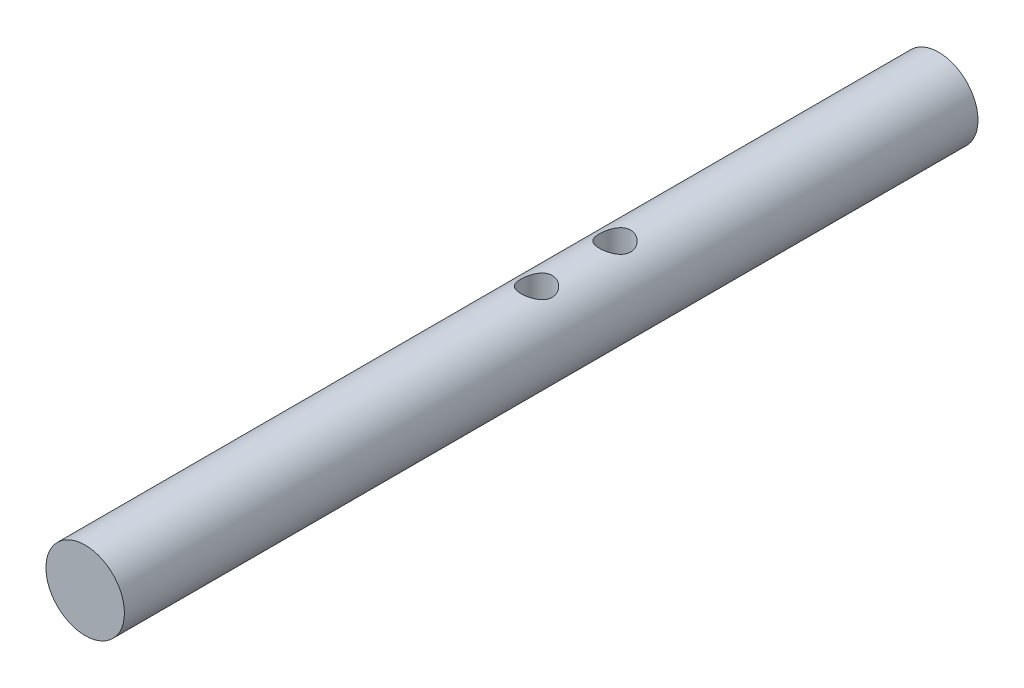
ISO-10303-21;
HEADER;
FILE_DESCRIPTION(('STEP AP214'),'2;1');
FILE_NAME('part.step','',(''),(''),'','','');
FILE_SCHEMA(('AUTOMOTIVE_DESIGN { 1 0 10303 214 1 1 1 1 }'));
ENDSEC;
DATA;
#1=APPLICATION_CONTEXT('core data for automotive mechanical design processes');
#2=APPLICATION_PROTOCOL_DEFINITION('international standard','automotive_design',2000,#1);
#3=PRODUCT_CONTEXT('',#1,'mechanical');
#4=PRODUCT('Part','Part','',(#3));
#5=PRODUCT_RELATED_PRODUCT_CATEGORY('part','',(#4));
#6=PRODUCT_DEFINITION_FORMATION('','',#4);
#7=PRODUCT_DEFINITION_CONTEXT('part definition',#1,'design');
#8=PRODUCT_DEFINITION('design','',#6,#7);
#9=PRODUCT_DEFINITION_SHAPE('','',#8);
#10=(LENGTH_UNIT() NAMED_UNIT(*) SI_UNIT(.MILLI.,.METRE.));
#11=(NAMED_UNIT(*) PLANE_ANGLE_UNIT() SI_UNIT($,.RADIAN.));
#12=(NAMED_UNIT(*) SI_UNIT($,.STERADIAN.) SOLID_ANGLE_UNIT());
#13=UNCERTAINTY_MEASURE_WITH_UNIT(LENGTH_MEASURE(1.E-05),#10,'distance_accuracy_value','');
#14=(GEOMETRIC_REPRESENTATION_CONTEXT(3) GLOBAL_UNCERTAINTY_ASSIGNED_CONTEXT((#13)) GLOBAL_UNIT_ASSIGNED_CONTEXT((#10,
#11,#12)) REPRESENTATION_CONTEXT('',''));
#15=CARTESIAN_POINT('',(0.,0.,0.));
#16=DIRECTION('',(0.,0.,1.));
#17=DIRECTION('',(1.,0.,0.));
#18=AXIS2_PLACEMENT_3D('',#15,#16,#17);
#19=CARTESIAN_POINT('',(0.,0.,87.));
#20=DIRECTION('',(0.,0.,-1.));
#21=DIRECTION('',(-1.,0.,0.));
#22=AXIS2_PLACEMENT_3D('',#19,#20,#21);
#23=CYLINDRICAL_SURFACE('',#22,4.);
#24=CARTESIAN_POINT('',(0.,-4.,34.6));
#25=CARTESIAN_POINT('',(0.0859944043543132,-3.99999416981668,34.599992118541));
#26=CARTESIAN_POINT('',(0.172138051272539,-3.99719435445546,34.5930257983293));
#27=CARTESIAN_POINT('',(0.341997184334317,-3.98626762480513,34.565401837183));
#28=CARTESIAN_POINT('',(0.425705422048998,-3.97812622959102,34.5447069767311));
#29=CARTESIAN_POINT('',(0.587963138181921,-3.95739367370495,34.4904991375529));
#30=CARTESIAN_POINT('',(0.666528529293566,-3.94481709091258,34.4570281230266));
#31=CARTESIAN_POINT('',(0.816857576262693,-3.91645288636862,34.3783846613388));
#32=CARTESIAN_POINT('',(0.888623581400793,-3.90066637966445,34.3332162760649));
#33=CARTESIAN_POINT('',(1.02680080605631,-3.86664708936335,34.2302116011513));
#34=CARTESIAN_POINT('',(1.09284981804017,-3.84833837543352,34.1719146750078));
#35=CARTESIAN_POINT('',(1.21454000382778,-3.81168461524956,34.0452799972186));
#36=CARTESIAN_POINT('',(1.27017608570683,-3.79333955563034,33.9769373622306));
#37=CARTESIAN_POINT('',(1.3718996538343,-3.75778233437709,33.8284575438062));
#38=CARTESIAN_POINT('',(1.41745198495638,-3.74065692771961,33.7479308111814));
#39=CARTESIAN_POINT('',(1.49420377522972,-3.71066917749434,33.579570881264));
#40=CARTESIAN_POINT('',(1.52541005142867,-3.69780480995341,33.4917411777213));
#41=CARTESIAN_POINT('',(1.57111905871669,-3.67861086128655,33.3154301331263));
#42=CARTESIAN_POINT('',(1.58631517264452,-3.67201136284484,33.227159011539));
#43=CARTESIAN_POINT('',(1.60173836931202,-3.66531203239315,33.0490920013542));
#44=CARTESIAN_POINT('',(1.60197281305058,-3.66520900418215,32.9592968843));
#45=CARTESIAN_POINT('',(1.58799149400363,-3.67128400223995,32.7873946628336));
#46=CARTESIAN_POINT('',(1.57478025144411,-3.6770254003076,32.7051874284728));
#47=CARTESIAN_POINT('',(1.53595750423826,-3.69340950086269,32.5442723551946));
#48=CARTESIAN_POINT('',(1.51034383584371,-3.70405305857338,32.4655651295118));
#49=CARTESIAN_POINT('',(1.44695578604086,-3.72927588070824,32.3119857310432));
#50=CARTESIAN_POINT('',(1.40894388985225,-3.7439310342463,32.2372246087563));
#51=CARTESIAN_POINT('',(1.32200516858577,-3.77550493111912,32.0948673469107));
#52=CARTESIAN_POINT('',(1.27307424408067,-3.79242452365479,32.0272739124778));
#53=CARTESIAN_POINT('',(1.16124047956355,-3.82821389393817,31.8956722169584));
#54=CARTESIAN_POINT('',(1.09754997037651,-3.84713331980921,31.8323450164432));
#55=CARTESIAN_POINT('',(0.960251541944155,-3.88367859966626,31.7170524175984));
#56=CARTESIAN_POINT('',(0.886641652267547,-3.9013041955626,31.6650892820718));
#57=CARTESIAN_POINT('',(0.729662122084675,-3.93371745011639,31.5731060420673));
#58=CARTESIAN_POINT('',(0.646128393077183,-3.94844216076332,31.5333421750424));
#59=CARTESIAN_POINT('',(0.472819012386307,-3.97291862663007,31.4686657111376));
#60=CARTESIAN_POINT('',(0.383046557479741,-3.98267290769906,31.4437455699541));
#61=CARTESIAN_POINT('',(0.205516710086258,-3.99564911605528,31.4108413636642));
#62=CARTESIAN_POINT('',(0.117954635188429,-3.99922356666811,31.4019420365972));
#63=CARTESIAN_POINT('',(-0.0574762478462529,-4.00054782808505,31.3986295195771));
#64=CARTESIAN_POINT('',(-0.145344970579138,-3.99829914865833,31.404212574762));
#65=CARTESIAN_POINT('',(-0.31474619129759,-3.98846053651002,31.4290334020416));
#66=CARTESIAN_POINT('',(-0.39638599342038,-3.98111513076419,31.4476463842808));
#67=CARTESIAN_POINT('',(-0.555308342448624,-3.962075531244,31.4971485666478));
#68=CARTESIAN_POINT('',(-0.632590328179876,-3.95038077885224,31.5280393437349));
#69=CARTESIAN_POINT('',(-0.783263028653363,-3.92333275816649,31.602227951744));
#70=CARTESIAN_POINT('',(-0.856462418204326,-3.90787852783843,31.6458763776345));
#71=CARTESIAN_POINT('',(-0.994754872997245,-3.8749869179642,31.7439522591245));
#72=CARTESIAN_POINT('',(-1.0598446726089,-3.85754874488216,31.7983840343381));
#73=CARTESIAN_POINT('',(-1.18457843442305,-3.82116094110489,31.9206960103597));
#74=CARTESIAN_POINT('',(-1.24357914704485,-3.80218753140042,31.989226833205));
#75=CARTESIAN_POINT('',(-1.34940095793097,-3.76593338333706,32.1355520664075));
#76=CARTESIAN_POINT('',(-1.39622004907001,-3.74865292421209,32.213348000272));
#77=CARTESIAN_POINT('',(-1.4766460015453,-3.71771439926167,32.3771693556753));
#78=CARTESIAN_POINT('',(-1.51012047562756,-3.7040930470783,32.4632671993699));
#79=CARTESIAN_POINT('',(-1.56183697576424,-3.68258938782345,32.6405869213721));
#80=CARTESIAN_POINT('',(-1.58009024421545,-3.67470284556799,32.7318049646499));
#81=CARTESIAN_POINT('',(-1.59977249382272,-3.66617407439941,32.9097023214196));
#82=CARTESIAN_POINT('',(-1.60231766584229,-3.66505136806537,32.9962358716747));
#83=CARTESIAN_POINT('',(-1.59344252742202,-3.66891868826478,33.1684358861706));
#84=CARTESIAN_POINT('',(-1.58202399033102,-3.67390793859835,33.2541024591221));
#85=CARTESIAN_POINT('',(-1.54645709292292,-3.68901319263217,33.418665751884));
#86=CARTESIAN_POINT('',(-1.52282999485678,-3.6989186546196,33.4976962195464));
#87=CARTESIAN_POINT('',(-1.46400435879281,-3.72259200986157,33.6507029036908));
#88=CARTESIAN_POINT('',(-1.42880262511505,-3.73636096964805,33.7246777175199));
#89=CARTESIAN_POINT('',(-1.34549821020778,-3.76718887683593,33.8700876954166));
#90=CARTESIAN_POINT('',(-1.29677226812759,-3.78439105850594,33.9411349361044));
#91=CARTESIAN_POINT('',(-1.18871369541719,-3.8197104349779,34.074394653763));
#92=CARTESIAN_POINT('',(-1.12937786785449,-3.83782790438725,34.1366044577027));
#93=CARTESIAN_POINT('',(-0.997204405017967,-3.87434853669915,34.2545622826109));
#94=CARTESIAN_POINT('',(-0.923740800916907,-3.89269406369748,34.3096298455185));
#95=CARTESIAN_POINT('',(-0.76792025622862,-3.92640325370973,34.4066696340973));
#96=CARTESIAN_POINT('',(-0.685559203637787,-3.94176552874325,34.448635769722));
#97=CARTESIAN_POINT('',(-0.515790449996161,-3.96751771852689,34.5172977721522));
#98=CARTESIAN_POINT('',(-0.428505294575756,-3.97799490444022,34.5442634588483));
#99=CARTESIAN_POINT('',(-0.250301237024976,-3.99315444967493,34.5829112967634));
#100=CARTESIAN_POINT('',(-0.15939482068713,-3.9978551959651,34.5946419493951));
#101=CARTESIAN_POINT('',(-0.0455298383127436,-3.99980719603309,34.5995163047826));
#102=CARTESIAN_POINT('',(-0.0227701509926067,-4.00000154375341,34.6000020869034));
#103=CARTESIAN_POINT('',(0.,-4.,34.6));
#104=B_SPLINE_CURVE_WITH_KNOTS('',3,(#24,#25,#26,#27,#28,#29,#30,#31,#32,#33,#34,#35,#36,#37,
#38,#39,#40,#41,#42,#43,#44,#45,#46,#47,#48,#49,#50,#51,#52,#53,#54,#55,#56,#57,#58,#59,#60,#61,
#62,#63,#64,#65,#66,#67,#68,#69,#70,#71,#72,#73,#74,#75,#76,#77,#78,#79,#80,#81,#82,#83,#84,#85,
#86,#87,#88,#89,#90,#91,#92,#93,#94,#95,#96,#97,#98,#99,#100,#101,#102,#103),.UNSPECIFIED.,.T.,
.F.,(4,2,2,2,2,2,2,2,2,2,2,2,2,2,2,2,2,2,2,2,2,2,2,2,2,2,2,2,2,2,2,2,2,2,2,2,2,2,2,4),(0.,
0.257922390314457,0.516546908806347,0.774329165977264,1.03202202854387,1.30077905360318,
1.56966715947529,1.85052207055373,2.13124338494615,2.39923284247063,2.6670904507239,
2.91630662721097,3.16556629804837,3.41991301039053,3.67435537550546,3.94846679349245,
4.22263274271786,4.50221530530245,4.78165564891032,5.04455347622405,5.30738314856065,
5.55840364451492,5.80945639195037,6.0681881071861,6.32702367599175,6.6029477969953,
6.87891735234998,7.15756036112661,7.43599738116746,7.69439738714198,7.95276458050435,
8.20091454839014,8.44913308644129,8.71156374445353,8.97407361078714,9.25360338827068,
9.53326290912426,9.80771440810654,10.0812900192347,10.1495843671744),.UNSPECIFIED.);
#105=CARTESIAN_POINT('',(0.,-4.,34.6));
#106=VERTEX_POINT('',#105);
#107=EDGE_CURVE('E10',#106,#106,#104,.T.);
#108=ORIENTED_EDGE('',*,*,#107,.T.);
#109=EDGE_LOOP('',(#108));
#110=FACE_BOUND('',#109,.T.);
#111=CARTESIAN_POINT('',(0.,4.,34.6));
#112=CARTESIAN_POINT('',(-0.0859944043543132,3.99999416981668,34.599992118541));
#113=CARTESIAN_POINT('',(-0.172138051272539,3.99719435445546,34.5930257983293));
#114=CARTESIAN_POINT('',(-0.341997184334317,3.98626762480513,34.565401837183));
#115=CARTESIAN_POINT('',(-0.425705422048998,3.97812622959102,34.5447069767311));
#116=CARTESIAN_POINT('',(-0.587963138181921,3.95739367370495,34.4904991375529));
#117=CARTESIAN_POINT('',(-0.666528529293566,3.94481709091258,34.4570281230266));
#118=CARTESIAN_POINT('',(-0.816857576262693,3.91645288636862,34.3783846613388));
#119=CARTESIAN_POINT('',(-0.888623581400793,3.90066637966445,34.3332162760649));
#120=CARTESIAN_POINT('',(-1.02680080605631,3.86664708936335,34.2302116011513));
#121=CARTESIAN_POINT('',(-1.09284981804017,3.84833837543352,34.1719146750078));
#122=CARTESIAN_POINT('',(-1.21454000382778,3.81168461524956,34.0452799972186));
#123=CARTESIAN_POINT('',(-1.27017608570683,3.79333955563034,33.9769373622306));
#124=CARTESIAN_POINT('',(-1.3718996538343,3.75778233437709,33.8284575438062));
#125=CARTESIAN_POINT('',(-1.41745198495638,3.74065692771961,33.7479308111814));
#126=CARTESIAN_POINT('',(-1.49420377522972,3.71066917749434,33.579570881264));
#127=CARTESIAN_POINT('',(-1.52541005142867,3.69780480995341,33.4917411777213));
#128=CARTESIAN_POINT('',(-1.57111905871669,3.67861086128655,33.3154301331263));
#129=CARTESIAN_POINT('',(-1.58631517264452,3.67201136284484,33.227159011539));
#130=CARTESIAN_POINT('',(-1.60173836931202,3.66531203239315,33.0490920013542));
#131=CARTESIAN_POINT('',(-1.60197281305058,3.66520900418215,32.9592968843));
#132=CARTESIAN_POINT('',(-1.58799149400363,3.67128400223995,32.7873946628336));
#133=CARTESIAN_POINT('',(-1.57478025144411,3.6770254003076,32.7051874284728));
#134=CARTESIAN_POINT('',(-1.53595750423826,3.69340950086269,32.5442723551946));
#135=CARTESIAN_POINT('',(-1.51034383584371,3.70405305857338,32.4655651295118));
#136=CARTESIAN_POINT('',(-1.44695578604086,3.72927588070824,32.3119857310432));
#137=CARTESIAN_POINT('',(-1.40894388985225,3.7439310342463,32.2372246087563));
#138=CARTESIAN_POINT('',(-1.32200516858577,3.77550493111912,32.0948673469107));
#139=CARTESIAN_POINT('',(-1.27307424408067,3.79242452365479,32.0272739124778));
#140=CARTESIAN_POINT('',(-1.16124047956355,3.82821389393817,31.8956722169584));
#141=CARTESIAN_POINT('',(-1.09754997037651,3.84713331980921,31.8323450164432));
#142=CARTESIAN_POINT('',(-0.960251541944155,3.88367859966626,31.7170524175984));
#143=CARTESIAN_POINT('',(-0.886641652267547,3.9013041955626,31.6650892820718));
#144=CARTESIAN_POINT('',(-0.729662122084675,3.93371745011639,31.5731060420673));
#145=CARTESIAN_POINT('',(-0.646128393077183,3.94844216076332,31.5333421750424));
#146=CARTESIAN_POINT('',(-0.472819012386307,3.97291862663007,31.4686657111376));
#147=CARTESIAN_POINT('',(-0.383046557479741,3.98267290769906,31.4437455699541));
#148=CARTESIAN_POINT('',(-0.205516710086258,3.99564911605528,31.4108413636642));
#149=CARTESIAN_POINT('',(-0.117954635188429,3.99922356666811,31.4019420365972));
#150=CARTESIAN_POINT('',(0.0574762478462529,4.00054782808505,31.3986295195771));
#151=CARTESIAN_POINT('',(0.145344970579138,3.99829914865833,31.404212574762));
#152=CARTESIAN_POINT('',(0.31474619129759,3.98846053651002,31.4290334020416));
#153=CARTESIAN_POINT('',(0.39638599342038,3.98111513076419,31.4476463842808));
#154=CARTESIAN_POINT('',(0.555308342448624,3.962075531244,31.4971485666478));
#155=CARTESIAN_POINT('',(0.632590328179876,3.95038077885224,31.5280393437349));
#156=CARTESIAN_POINT('',(0.783263028653363,3.92333275816649,31.602227951744));
#157=CARTESIAN_POINT('',(0.856462418204326,3.90787852783843,31.6458763776345));
#158=CARTESIAN_POINT('',(0.994754872997245,3.8749869179642,31.7439522591245));
#159=CARTESIAN_POINT('',(1.0598446726089,3.85754874488216,31.7983840343381));
#160=CARTESIAN_POINT('',(1.18457843442305,3.82116094110489,31.9206960103597));
#161=CARTESIAN_POINT('',(1.24357914704485,3.80218753140042,31.989226833205));
#162=CARTESIAN_POINT('',(1.34940095793097,3.76593338333706,32.1355520664075));
#163=CARTESIAN_POINT('',(1.39622004907001,3.74865292421209,32.213348000272));
#164=CARTESIAN_POINT('',(1.4766460015453,3.71771439926167,32.3771693556753));
#165=CARTESIAN_POINT('',(1.51012047562756,3.7040930470783,32.4632671993699));
#166=CARTESIAN_POINT('',(1.56183697576424,3.68258938782345,32.6405869213721));
#167=CARTESIAN_POINT('',(1.58009024421545,3.67470284556799,32.7318049646499));
#168=CARTESIAN_POINT('',(1.59977249382272,3.66617407439941,32.9097023214196));
#169=CARTESIAN_POINT('',(1.60231766584229,3.66505136806537,32.9962358716747));
#170=CARTESIAN_POINT('',(1.59344252742202,3.66891868826478,33.1684358861706));
#171=CARTESIAN_POINT('',(1.58202399033102,3.67390793859835,33.2541024591221));
#172=CARTESIAN_POINT('',(1.54645709292292,3.68901319263217,33.418665751884));
#173=CARTESIAN_POINT('',(1.52282999485678,3.6989186546196,33.4976962195464));
#174=CARTESIAN_POINT('',(1.46400435879281,3.72259200986157,33.6507029036908));
#175=CARTESIAN_POINT('',(1.42880262511505,3.73636096964805,33.7246777175199));
#176=CARTESIAN_POINT('',(1.34549821020778,3.76718887683593,33.8700876954166));
#177=CARTESIAN_POINT('',(1.29677226812759,3.78439105850594,33.9411349361044));
#178=CARTESIAN_POINT('',(1.18871369541719,3.8197104349779,34.074394653763));
#179=CARTESIAN_POINT('',(1.12937786785449,3.83782790438725,34.1366044577027));
#180=CARTESIAN_POINT('',(0.997204405017967,3.87434853669915,34.2545622826109));
#181=CARTESIAN_POINT('',(0.923740800916907,3.89269406369748,34.3096298455185));
#182=CARTESIAN_POINT('',(0.76792025622862,3.92640325370973,34.4066696340973));
#183=CARTESIAN_POINT('',(0.685559203637787,3.94176552874325,34.448635769722));
#184=CARTESIAN_POINT('',(0.515790449996161,3.96751771852689,34.5172977721522));
#185=CARTESIAN_POINT('',(0.428505294575756,3.97799490444022,34.5442634588483));
#186=CARTESIAN_POINT('',(0.250301237024976,3.99315444967493,34.5829112967634));
#187=CARTESIAN_POINT('',(0.15939482068713,3.9978551959651,34.5946419493951));
#188=CARTESIAN_POINT('',(0.0455298383127436,3.99980719603309,34.5995163047826));
#189=CARTESIAN_POINT('',(0.0227701509926067,4.00000154375341,34.6000020869034));
#190=CARTESIAN_POINT('',(0.,4.,34.6));
#191=B_SPLINE_CURVE_WITH_KNOTS('',3,(#111,#112,#113,#114,#115,#116,#117,#118,#119,#120,#121,
#122,#123,#124,#125,#126,#127,#128,#129,#130,#131,#132,#133,#134,#135,#136,#137,#138,#139,#140,
#141,#142,#143,#144,#145,#146,#147,#148,#149,#150,#151,#152,#153,#154,#155,#156,#157,#158,#159,
#160,#161,#162,#163,#164,#165,#166,#167,#168,#169,#170,#171,#172,#173,#174,#175,#176,#177,#178,
#179,#180,#181,#182,#183,#184,#185,#186,#187,#188,#189,#190),.UNSPECIFIED.,.T.,.F.,(4,2,2,2,2,2,
2,2,2,2,2,2,2,2,2,2,2,2,2,2,2,2,2,2,2,2,2,2,2,2,2,2,2,2,2,2,2,2,2,4),(0.,0.257922390314457,
0.516546908806347,0.774329165977264,1.03202202854387,1.30077905360318,1.56966715947529,
1.85052207055373,2.13124338494615,2.39923284247063,2.6670904507239,2.91630662721097,
3.16556629804837,3.41991301039053,3.67435537550546,3.94846679349245,4.22263274271786,
4.50221530530245,4.78165564891032,5.04455347622405,5.30738314856065,5.55840364451492,
5.80945639195037,6.0681881071861,6.32702367599175,6.6029477969953,6.87891735234998,
7.15756036112661,7.43599738116746,7.69439738714198,7.95276458050435,8.20091454839014,
8.44913308644129,8.71156374445353,8.97407361078714,9.25360338827068,9.53326290912426,
9.80771440810654,10.0812900192347,10.1495843671744),.UNSPECIFIED.);
#192=CARTESIAN_POINT('',(0.,4.,34.6));
#193=VERTEX_POINT('',#192);
#194=EDGE_CURVE('E43',#193,#193,#191,.T.);
#195=ORIENTED_EDGE('',*,*,#194,.T.);
#196=EDGE_LOOP('',(#195));
#197=FACE_BOUND('',#196,.T.);
#198=CARTESIAN_POINT('',(0.,-4.,42.6));
#199=CARTESIAN_POINT('',(0.0859944043543127,-3.99999416981668,42.599992118541));
#200=CARTESIAN_POINT('',(0.172138051272539,-3.99719435445546,42.5930257983293));
#201=CARTESIAN_POINT('',(0.341997184334316,-3.98626762480513,42.565401837183));
#202=CARTESIAN_POINT('',(0.425705422048997,-3.97812622959102,42.5447069767311));
#203=CARTESIAN_POINT('',(0.587963138181921,-3.95739367370495,42.4904991375529));
#204=CARTESIAN_POINT('',(0.666528529293566,-3.94481709091258,42.4570281230266));
#205=CARTESIAN_POINT('',(0.816857576262693,-3.91645288636862,42.3783846613388));
#206=CARTESIAN_POINT('',(0.888623581400793,-3.90066637966445,42.3332162760649));
#207=CARTESIAN_POINT('',(1.02680080605631,-3.86664708936335,42.2302116011513));
#208=CARTESIAN_POINT('',(1.09284981804017,-3.84833837543353,42.1719146750078));
#209=CARTESIAN_POINT('',(1.21454000382777,-3.81168461524956,42.0452799972186));
#210=CARTESIAN_POINT('',(1.27017608570682,-3.79333955563034,41.9769373622306));
#211=CARTESIAN_POINT('',(1.3718996538343,-3.75778233437709,41.8284575438062));
#212=CARTESIAN_POINT('',(1.41745198495638,-3.74065692771961,41.7479308111814));
#213=CARTESIAN_POINT('',(1.49420377522972,-3.71066917749434,41.579570881264));
#214=CARTESIAN_POINT('',(1.52541005142867,-3.69780480995341,41.4917411777213));
#215=CARTESIAN_POINT('',(1.57111905871669,-3.67861086128655,41.3154301331263));
#216=CARTESIAN_POINT('',(1.58631517264452,-3.67201136284484,41.227159011539));
#217=CARTESIAN_POINT('',(1.60173836931202,-3.66531203239315,41.0490920013542));
#218=CARTESIAN_POINT('',(1.60197281305058,-3.66520900418215,40.9592968843));
#219=CARTESIAN_POINT('',(1.58799149400363,-3.67128400223995,40.7873946628336));
#220=CARTESIAN_POINT('',(1.57478025144411,-3.6770254003076,40.7051874284728));
#221=CARTESIAN_POINT('',(1.53595750423826,-3.69340950086269,40.5442723551946));
#222=CARTESIAN_POINT('',(1.51034383584371,-3.70405305857338,40.4655651295118));
#223=CARTESIAN_POINT('',(1.44695578604086,-3.72927588070824,40.3119857310432));
#224=CARTESIAN_POINT('',(1.40894388985225,-3.7439310342463,40.2372246087563));
#225=CARTESIAN_POINT('',(1.32200516858577,-3.77550493111912,40.0948673469107));
#226=CARTESIAN_POINT('',(1.27307424408067,-3.79242452365479,40.0272739124778));
#227=CARTESIAN_POINT('',(1.16124047956355,-3.82821389393817,39.8956722169584));
#228=CARTESIAN_POINT('',(1.09754997037651,-3.84713331980921,39.8323450164432));
#229=CARTESIAN_POINT('',(0.960251541944158,-3.88367859966626,39.7170524175984));
#230=CARTESIAN_POINT('',(0.886641652267549,-3.9013041955626,39.6650892820718));
#231=CARTESIAN_POINT('',(0.729662122084674,-3.93371745011639,39.5731060420673));
#232=CARTESIAN_POINT('',(0.646128393077183,-3.94844216076332,39.5333421750424));
#233=CARTESIAN_POINT('',(0.472819012386307,-3.97291862663007,39.4686657111376));
#234=CARTESIAN_POINT('',(0.383046557479741,-3.98267290769906,39.4437455699541));
#235=CARTESIAN_POINT('',(0.205516710086258,-3.99564911605528,39.4108413636642));
#236=CARTESIAN_POINT('',(0.117954635188429,-3.99922356666811,39.4019420365971));
#237=CARTESIAN_POINT('',(-0.0574762478462528,-4.00054782808505,39.3986295195771));
#238=CARTESIAN_POINT('',(-0.145344970579138,-3.99829914865833,39.404212574762));
#239=CARTESIAN_POINT('',(-0.31474619129759,-3.98846053651002,39.4290334020416));
#240=CARTESIAN_POINT('',(-0.39638599342038,-3.98111513076419,39.4476463842808));
#241=CARTESIAN_POINT('',(-0.555308342448624,-3.962075531244,39.4971485666479));
#242=CARTESIAN_POINT('',(-0.632590328179875,-3.95038077885224,39.5280393437349));
#243=CARTESIAN_POINT('',(-0.783263028653361,-3.92333275816649,39.602227951744));
#244=CARTESIAN_POINT('',(-0.856462418204325,-3.90787852783843,39.6458763776345));
#245=CARTESIAN_POINT('',(-0.994754872997244,-3.8749869179642,39.7439522591245));
#246=CARTESIAN_POINT('',(-1.0598446726089,-3.85754874488216,39.7983840343381));
#247=CARTESIAN_POINT('',(-1.18457843442305,-3.82116094110489,39.9206960103597));
#248=CARTESIAN_POINT('',(-1.24357914704485,-3.80218753140042,39.989226833205));
#249=CARTESIAN_POINT('',(-1.34940095793097,-3.76593338333706,40.1355520664075));
#250=CARTESIAN_POINT('',(-1.39622004907001,-3.74865292421209,40.213348000272));
#251=CARTESIAN_POINT('',(-1.4766460015453,-3.71771439926167,40.3771693556753));
#252=CARTESIAN_POINT('',(-1.51012047562756,-3.7040930470783,40.4632671993698));
#253=CARTESIAN_POINT('',(-1.56183697576424,-3.68258938782345,40.6405869213721));
#254=CARTESIAN_POINT('',(-1.58009024421545,-3.67470284556799,40.7318049646499));
#255=CARTESIAN_POINT('',(-1.59977249382272,-3.66617407439941,40.9097023214196));
#256=CARTESIAN_POINT('',(-1.60231766584229,-3.66505136806537,40.9962358716747));
#257=CARTESIAN_POINT('',(-1.59344252742202,-3.66891868826478,41.1684358861706));
#258=CARTESIAN_POINT('',(-1.58202399033102,-3.67390793859835,41.2541024591221));
#259=CARTESIAN_POINT('',(-1.54645709292292,-3.68901319263217,41.418665751884));
#260=CARTESIAN_POINT('',(-1.52282999485678,-3.6989186546196,41.4976962195464));
#261=CARTESIAN_POINT('',(-1.46400435879281,-3.72259200986157,41.6507029036908));
#262=CARTESIAN_POINT('',(-1.42880262511505,-3.73636096964805,41.7246777175199));
#263=CARTESIAN_POINT('',(-1.34549821020778,-3.76718887683593,41.8700876954166));
#264=CARTESIAN_POINT('',(-1.29677226812759,-3.78439105850594,41.9411349361044));
#265=CARTESIAN_POINT('',(-1.18871369541719,-3.8197104349779,42.074394653763));
#266=CARTESIAN_POINT('',(-1.12937786785449,-3.83782790438725,42.1366044577027));
#267=CARTESIAN_POINT('',(-0.997204405017967,-3.87434853669915,42.2545622826109));
#268=CARTESIAN_POINT('',(-0.923740800916907,-3.89269406369748,42.3096298455185));
#269=CARTESIAN_POINT('',(-0.76792025622862,-3.92640325370973,42.4066696340973));
#270=CARTESIAN_POINT('',(-0.685559203637787,-3.94176552874325,42.448635769722));
#271=CARTESIAN_POINT('',(-0.51579044999616,-3.96751771852689,42.5172977721522));
#272=CARTESIAN_POINT('',(-0.428505294575755,-3.97799490444022,42.5442634588483));
#273=CARTESIAN_POINT('',(-0.250301237024975,-3.99315444967493,42.5829112967634));
#274=CARTESIAN_POINT('',(-0.159394820687129,-3.9978551959651,42.5946419493951));
#275=CARTESIAN_POINT('',(-0.0455298383127436,-3.99980719603309,42.5995163047826));
#276=CARTESIAN_POINT('',(-0.0227701509926067,-4.00000154375341,42.6000020869034));
#277=CARTESIAN_POINT('',(0.,-4.,42.6));
#278=B_SPLINE_CURVE_WITH_KNOTS('',3,(#198,#199,#200,#201,#202,#203,#204,#205,#206,#207,#208,
#209,#210,#211,#212,#213,#214,#215,#216,#217,#218,#219,#220,#221,#222,#223,#224,#225,#226,#227,
#228,#229,#230,#231,#232,#233,#234,#235,#236,#237,#238,#239,#240,#241,#242,#243,#244,#245,#246,
#247,#248,#249,#250,#251,#252,#253,#254,#255,#256,#257,#258,#259,#260,#261,#262,#263,#264,#265,
#266,#267,#268,#269,#270,#271,#272,#273,#274,#275,#276,#277),.UNSPECIFIED.,.T.,.F.,(4,2,2,2,2,2,
2,2,2,2,2,2,2,2,2,2,2,2,2,2,2,2,2,2,2,2,2,2,2,2,2,2,2,2,2,2,2,2,2,4),(0.,0.257922390314456,
0.516546908806347,0.774329165977264,1.03202202854387,1.30077905360317,1.56966715947529,
1.85052207055373,2.13124338494615,2.39923284247063,2.6670904507239,2.91630662721097,
3.16556629804837,3.41991301039052,3.67435537550546,3.94846679349244,4.22263274271786,
4.50221530530245,4.78165564891032,5.04455347622405,5.30738314856065,5.55840364451492,
5.80945639195037,6.0681881071861,6.32702367599175,6.6029477969953,6.87891735234998,
7.15756036112661,7.43599738116746,7.69439738714198,7.95276458050436,8.20091454839014,
8.44913308644129,8.71156374445353,8.97407361078714,9.25360338827068,9.53326290912426,
9.80771440810654,10.0812900192347,10.1495843671744),.UNSPECIFIED.);
#279=CARTESIAN_POINT('',(0.,-4.,42.6));
#280=VERTEX_POINT('',#279);
#281=EDGE_CURVE('E47',#280,#280,#278,.T.);
#282=ORIENTED_EDGE('',*,*,#281,.T.);
#283=EDGE_LOOP('',(#282));
#284=FACE_BOUND('',#283,.T.);
#285=CARTESIAN_POINT('',(0.,4.,42.6));
#286=CARTESIAN_POINT('',(-0.0859944043543127,3.99999416981668,42.599992118541));
#287=CARTESIAN_POINT('',(-0.172138051272539,3.99719435445546,42.5930257983293));
#288=CARTESIAN_POINT('',(-0.341997184334316,3.98626762480513,42.565401837183));
#289=CARTESIAN_POINT('',(-0.425705422048997,3.97812622959102,42.5447069767311));
#290=CARTESIAN_POINT('',(-0.587963138181921,3.95739367370495,42.4904991375529));
#291=CARTESIAN_POINT('',(-0.666528529293566,3.94481709091258,42.4570281230266));
#292=CARTESIAN_POINT('',(-0.816857576262693,3.91645288636862,42.3783846613388));
#293=CARTESIAN_POINT('',(-0.888623581400793,3.90066637966445,42.3332162760649));
#294=CARTESIAN_POINT('',(-1.02680080605631,3.86664708936335,42.2302116011513));
#295=CARTESIAN_POINT('',(-1.09284981804017,3.84833837543353,42.1719146750078));
#296=CARTESIAN_POINT('',(-1.21454000382777,3.81168461524956,42.0452799972186));
#297=CARTESIAN_POINT('',(-1.27017608570682,3.79333955563034,41.9769373622306));
#298=CARTESIAN_POINT('',(-1.3718996538343,3.75778233437709,41.8284575438062));
#299=CARTESIAN_POINT('',(-1.41745198495638,3.74065692771961,41.7479308111814));
#300=CARTESIAN_POINT('',(-1.49420377522972,3.71066917749434,41.579570881264));
#301=CARTESIAN_POINT('',(-1.52541005142867,3.69780480995341,41.4917411777213));
#302=CARTESIAN_POINT('',(-1.57111905871669,3.67861086128655,41.3154301331263));
#303=CARTESIAN_POINT('',(-1.58631517264452,3.67201136284484,41.227159011539));
#304=CARTESIAN_POINT('',(-1.60173836931202,3.66531203239315,41.0490920013542));
#305=CARTESIAN_POINT('',(-1.60197281305058,3.66520900418215,40.9592968843));
#306=CARTESIAN_POINT('',(-1.58799149400363,3.67128400223995,40.7873946628336));
#307=CARTESIAN_POINT('',(-1.57478025144411,3.6770254003076,40.7051874284728));
#308=CARTESIAN_POINT('',(-1.53595750423826,3.69340950086269,40.5442723551946));
#309=CARTESIAN_POINT('',(-1.51034383584371,3.70405305857338,40.4655651295118));
#310=CARTESIAN_POINT('',(-1.44695578604086,3.72927588070824,40.3119857310432));
#311=CARTESIAN_POINT('',(-1.40894388985225,3.7439310342463,40.2372246087563));
#312=CARTESIAN_POINT('',(-1.32200516858577,3.77550493111912,40.0948673469107));
#313=CARTESIAN_POINT('',(-1.27307424408067,3.79242452365479,40.0272739124778));
#314=CARTESIAN_POINT('',(-1.16124047956355,3.82821389393817,39.8956722169584));
#315=CARTESIAN_POINT('',(-1.09754997037651,3.84713331980921,39.8323450164432));
#316=CARTESIAN_POINT('',(-0.960251541944158,3.88367859966626,39.7170524175984));
#317=CARTESIAN_POINT('',(-0.886641652267549,3.9013041955626,39.6650892820718));
#318=CARTESIAN_POINT('',(-0.729662122084674,3.93371745011639,39.5731060420673));
#319=CARTESIAN_POINT('',(-0.646128393077183,3.94844216076332,39.5333421750424));
#320=CARTESIAN_POINT('',(-0.472819012386307,3.97291862663007,39.4686657111376));
#321=CARTESIAN_POINT('',(-0.383046557479741,3.98267290769906,39.4437455699541));
#322=CARTESIAN_POINT('',(-0.205516710086258,3.99564911605528,39.4108413636642));
#323=CARTESIAN_POINT('',(-0.117954635188429,3.99922356666811,39.4019420365971));
#324=CARTESIAN_POINT('',(0.0574762478462528,4.00054782808505,39.3986295195771));
#325=CARTESIAN_POINT('',(0.145344970579138,3.99829914865833,39.404212574762));
#326=CARTESIAN_POINT('',(0.31474619129759,3.98846053651002,39.4290334020416));
#327=CARTESIAN_POINT('',(0.39638599342038,3.98111513076419,39.4476463842808));
#328=CARTESIAN_POINT('',(0.555308342448624,3.962075531244,39.4971485666479));
#329=CARTESIAN_POINT('',(0.632590328179875,3.95038077885224,39.5280393437349));
#330=CARTESIAN_POINT('',(0.783263028653361,3.92333275816649,39.602227951744));
#331=CARTESIAN_POINT('',(0.856462418204325,3.90787852783843,39.6458763776345));
#332=CARTESIAN_POINT('',(0.994754872997244,3.8749869179642,39.7439522591245));
#333=CARTESIAN_POINT('',(1.0598446726089,3.85754874488216,39.7983840343381));
#334=CARTESIAN_POINT('',(1.18457843442305,3.82116094110489,39.9206960103597));
#335=CARTESIAN_POINT('',(1.24357914704485,3.80218753140042,39.989226833205));
#336=CARTESIAN_POINT('',(1.34940095793097,3.76593338333706,40.1355520664075));
#337=CARTESIAN_POINT('',(1.39622004907001,3.74865292421209,40.213348000272));
#338=CARTESIAN_POINT('',(1.4766460015453,3.71771439926167,40.3771693556753));
#339=CARTESIAN_POINT('',(1.51012047562756,3.7040930470783,40.4632671993698));
#340=CARTESIAN_POINT('',(1.56183697576424,3.68258938782345,40.6405869213721));
#341=CARTESIAN_POINT('',(1.58009024421545,3.67470284556799,40.7318049646499));
#342=CARTESIAN_POINT('',(1.59977249382272,3.66617407439941,40.9097023214196));
#343=CARTESIAN_POINT('',(1.60231766584229,3.66505136806537,40.9962358716747));
#344=CARTESIAN_POINT('',(1.59344252742202,3.66891868826478,41.1684358861706));
#345=CARTESIAN_POINT('',(1.58202399033102,3.67390793859835,41.2541024591221));
#346=CARTESIAN_POINT('',(1.54645709292292,3.68901319263217,41.418665751884));
#347=CARTESIAN_POINT('',(1.52282999485678,3.6989186546196,41.4976962195464));
#348=CARTESIAN_POINT('',(1.46400435879281,3.72259200986157,41.6507029036908));
#349=CARTESIAN_POINT('',(1.42880262511505,3.73636096964805,41.7246777175199));
#350=CARTESIAN_POINT('',(1.34549821020778,3.76718887683593,41.8700876954166));
#351=CARTESIAN_POINT('',(1.29677226812759,3.78439105850594,41.9411349361044));
#352=CARTESIAN_POINT('',(1.18871369541719,3.8197104349779,42.074394653763));
#353=CARTESIAN_POINT('',(1.12937786785449,3.83782790438725,42.1366044577027));
#354=CARTESIAN_POINT('',(0.997204405017967,3.87434853669915,42.2545622826109));
#355=CARTESIAN_POINT('',(0.923740800916907,3.89269406369748,42.3096298455185));
#356=CARTESIAN_POINT('',(0.76792025622862,3.92640325370973,42.4066696340973));
#357=CARTESIAN_POINT('',(0.685559203637787,3.94176552874325,42.448635769722));
#358=CARTESIAN_POINT('',(0.51579044999616,3.96751771852689,42.5172977721522));
#359=CARTESIAN_POINT('',(0.428505294575755,3.97799490444022,42.5442634588483));
#360=CARTESIAN_POINT('',(0.250301237024975,3.99315444967493,42.5829112967634));
#361=CARTESIAN_POINT('',(0.159394820687129,3.9978551959651,42.5946419493951));
#362=CARTESIAN_POINT('',(0.0455298383127436,3.99980719603309,42.5995163047826));
#363=CARTESIAN_POINT('',(0.0227701509926067,4.00000154375341,42.6000020869034));
#364=CARTESIAN_POINT('',(0.,4.,42.6));
#365=B_SPLINE_CURVE_WITH_KNOTS('',3,(#285,#286,#287,#288,#289,#290,#291,#292,#293,#294,#295,
#296,#297,#298,#299,#300,#301,#302,#303,#304,#305,#306,#307,#308,#309,#310,#311,#312,#313,#314,
#315,#316,#317,#318,#319,#320,#321,#322,#323,#324,#325,#326,#327,#328,#329,#330,#331,#332,#333,
#334,#335,#336,#337,#338,#339,#340,#341,#342,#343,#344,#345,#346,#347,#348,#349,#350,#351,#352,
#353,#354,#355,#356,#357,#358,#359,#360,#361,#362,#363,#364),.UNSPECIFIED.,.T.,.F.,(4,2,2,2,2,2,
2,2,2,2,2,2,2,2,2,2,2,2,2,2,2,2,2,2,2,2,2,2,2,2,2,2,2,2,2,2,2,2,2,4),(0.,0.257922390314456,
0.516546908806347,0.774329165977264,1.03202202854387,1.30077905360317,1.56966715947529,
1.85052207055373,2.13124338494615,2.39923284247063,2.6670904507239,2.91630662721097,
3.16556629804837,3.41991301039052,3.67435537550546,3.94846679349244,4.22263274271786,
4.50221530530245,4.78165564891032,5.04455347622405,5.30738314856065,5.55840364451492,
5.80945639195037,6.0681881071861,6.32702367599175,6.6029477969953,6.87891735234998,
7.15756036112661,7.43599738116746,7.69439738714198,7.95276458050436,8.20091454839014,
8.44913308644129,8.71156374445353,8.97407361078714,9.25360338827068,9.53326290912426,
9.80771440810654,10.0812900192347,10.1495843671744),.UNSPECIFIED.);
#366=CARTESIAN_POINT('',(0.,4.,42.6));
#367=VERTEX_POINT('',#366);
#368=EDGE_CURVE('E51',#367,#367,#365,.T.);
#369=ORIENTED_EDGE('',*,*,#368,.T.);
#370=EDGE_LOOP('',(#369));
#371=FACE_BOUND('',#370,.T.);
#372=CARTESIAN_POINT('',(0.,0.,87.));
#373=DIRECTION('',(0.,0.,1.));
#374=DIRECTION('',(1.,0.,0.));
#375=AXIS2_PLACEMENT_3D('',#372,#373,#374);
#376=CIRCLE('',#375,4.);
#377=CARTESIAN_POINT('',(4.,0.,87.));
#378=VERTEX_POINT('',#377);
#379=EDGE_CURVE('E76',#378,#378,#376,.T.);
#380=ORIENTED_EDGE('',*,*,#379,.F.);
#381=EDGE_LOOP('',(#380));
#382=FACE_BOUND('',#381,.T.);
#383=CARTESIAN_POINT('',(0.,0.,0.));
#384=DIRECTION('',(0.,0.,1.));
#385=DIRECTION('',(1.,0.,0.));
#386=AXIS2_PLACEMENT_3D('',#383,#384,#385);
#387=CIRCLE('',#386,4.);
#388=CARTESIAN_POINT('',(4.,0.,0.));
#389=VERTEX_POINT('',#388);
#390=EDGE_CURVE('E77',#389,#389,#387,.T.);
#391=ORIENTED_EDGE('',*,*,#390,.T.);
#392=EDGE_LOOP('',(#391));
#393=FACE_BOUND('',#392,.T.);
#394=ADVANCED_FACE('F33',(#110,#197,#284,#371,#382,#393),#23,.T.);
#395=CARTESIAN_POINT('',(0.,0.,87.));
#396=DIRECTION('',(0.,0.,1.));
#397=DIRECTION('',(1.,0.,0.));
#398=AXIS2_PLACEMENT_3D('',#395,#396,#397);
#399=PLANE('',#398);
#400=ORIENTED_EDGE('',*,*,#379,.T.);
#401=EDGE_LOOP('',(#400));
#402=FACE_BOUND('',#401,.T.);
#403=ADVANCED_FACE('F70',(#402),#399,.T.);
#404=CARTESIAN_POINT('',(0.,0.,0.));
#405=DIRECTION('',(0.,0.,1.));
#406=DIRECTION('',(1.,0.,0.));
#407=AXIS2_PLACEMENT_3D('',#404,#405,#406);
#408=PLANE('',#407);
#409=ORIENTED_EDGE('',*,*,#390,.F.);
#410=EDGE_LOOP('',(#409));
#411=FACE_BOUND('',#410,.T.);
#412=ADVANCED_FACE('F68',(#411),#408,.F.);
#413=CARTESIAN_POINT('',(0.,-4.,41.));
#414=DIRECTION('',(0.,1.,0.));
#415=DIRECTION('',(0.,0.,1.));
#416=AXIS2_PLACEMENT_3D('',#413,#414,#415);
#417=CYLINDRICAL_SURFACE('',#416,1.6);
#418=ORIENTED_EDGE('',*,*,#368,.F.);
#419=EDGE_LOOP('',(#418));
#420=FACE_BOUND('',#419,.T.);
#421=ORIENTED_EDGE('',*,*,#281,.F.);
#422=EDGE_LOOP('',(#421));
#423=FACE_BOUND('',#422,.T.);
#424=ADVANCED_FACE('F62',(#420,#423),#417,.F.);
#425=CARTESIAN_POINT('',(0.,-4.,33.));
#426=DIRECTION('',(0.,1.,0.));
#427=DIRECTION('',(0.,0.,1.));
#428=AXIS2_PLACEMENT_3D('',#425,#426,#427);
#429=CYLINDRICAL_SURFACE('',#428,1.6);
#430=ORIENTED_EDGE('',*,*,#194,.F.);
#431=EDGE_LOOP('',(#430));
#432=FACE_BOUND('',#431,.T.);
#433=ORIENTED_EDGE('',*,*,#107,.F.);
#434=EDGE_LOOP('',(#433));
#435=FACE_BOUND('',#434,.T.);
#436=ADVANCED_FACE('F59',(#432,#435),#429,.F.);
#437=CLOSED_SHELL('',(#394,#403,#412,#424,#436));
#438=MANIFOLD_SOLID_BREP('B2',#437);
#439=ADVANCED_BREP_SHAPE_REPRESENTATION('',(#18,#438),#14);
#440=SHAPE_DEFINITION_REPRESENTATION(#9,#439);
ENDSEC;
END-ISO-10303-21;
